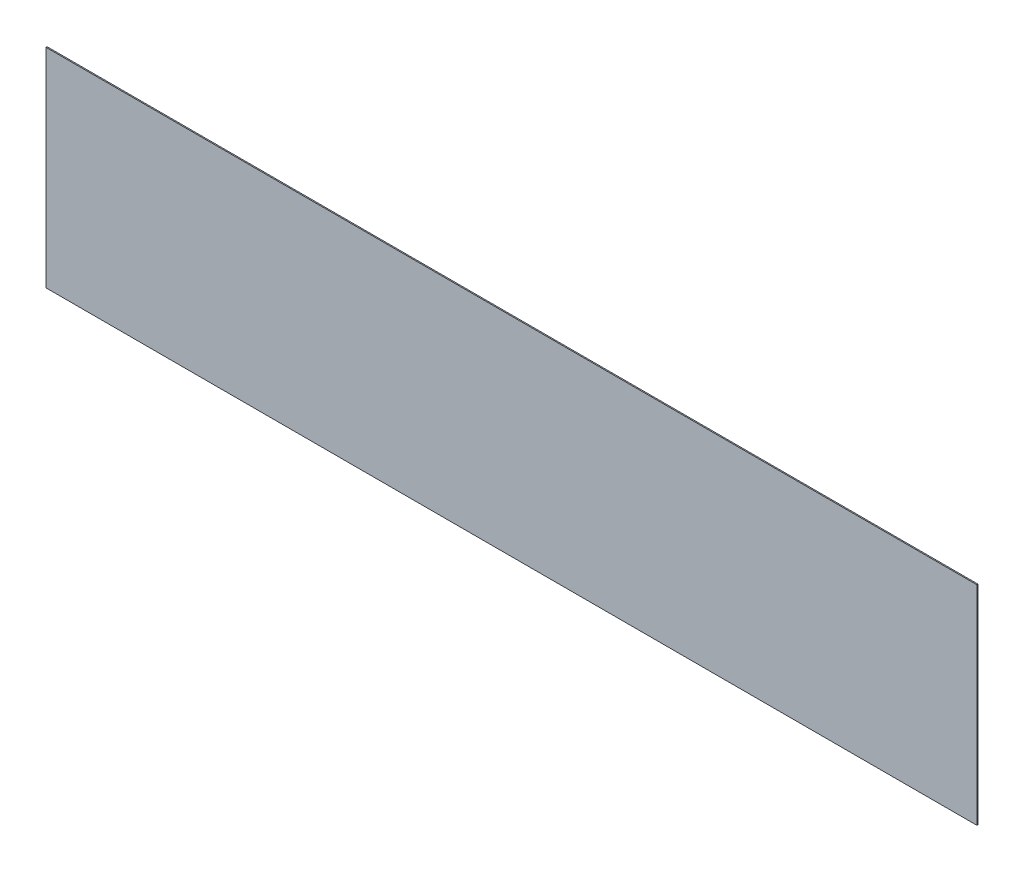
ISO-10303-21;
HEADER;
FILE_DESCRIPTION(('STEP AP214'),'2;1');
FILE_NAME('part.step','',(''),(''),'','','');
FILE_SCHEMA(('AUTOMOTIVE_DESIGN { 1 0 10303 214 1 1 1 1 }'));
ENDSEC;
DATA;
#1=APPLICATION_CONTEXT('core data for automotive mechanical design processes');
#2=APPLICATION_PROTOCOL_DEFINITION('international standard','automotive_design',2000,#1);
#3=PRODUCT_CONTEXT('',#1,'mechanical');
#4=PRODUCT('Part','Part','',(#3));
#5=PRODUCT_RELATED_PRODUCT_CATEGORY('part','',(#4));
#6=PRODUCT_DEFINITION_FORMATION('','',#4);
#7=PRODUCT_DEFINITION_CONTEXT('part definition',#1,'design');
#8=PRODUCT_DEFINITION('design','',#6,#7);
#9=PRODUCT_DEFINITION_SHAPE('','',#8);
#10=(LENGTH_UNIT() NAMED_UNIT(*) SI_UNIT(.MILLI.,.METRE.));
#11=(NAMED_UNIT(*) PLANE_ANGLE_UNIT() SI_UNIT($,.RADIAN.));
#12=(NAMED_UNIT(*) SI_UNIT($,.STERADIAN.) SOLID_ANGLE_UNIT());
#13=UNCERTAINTY_MEASURE_WITH_UNIT(LENGTH_MEASURE(1.E-05),#10,'distance_accuracy_value','');
#14=(GEOMETRIC_REPRESENTATION_CONTEXT(3) GLOBAL_UNCERTAINTY_ASSIGNED_CONTEXT((#13)) GLOBAL_UNIT_ASSIGNED_CONTEXT((#10,
#11,#12)) REPRESENTATION_CONTEXT('',''));
#15=CARTESIAN_POINT('',(0.,0.,0.));
#16=DIRECTION('',(0.,0.,1.));
#17=DIRECTION('',(1.,0.,0.));
#18=AXIS2_PLACEMENT_3D('',#15,#16,#17);
#19=CARTESIAN_POINT('',(-1333.5,298.45,3.175));
#20=DIRECTION('',(1.,0.,0.));
#21=DIRECTION('',(0.,1.,0.));
#22=AXIS2_PLACEMENT_3D('',#19,#20,#21);
#23=PLANE('',#22);
#24=DIRECTION('',(0.,-1.,0.));
#25=VECTOR('',#24,1.);
#26=CARTESIAN_POINT('',(-1333.5,298.45,0.));
#27=LINE('',#26,#25);
#28=CARTESIAN_POINT('',(-1333.5,298.45,0.));
#29=VERTEX_POINT('',#28);
#30=CARTESIAN_POINT('',(-1333.5,-298.45,0.));
#31=VERTEX_POINT('',#30);
#32=EDGE_CURVE('E96',#29,#31,#27,.T.);
#33=ORIENTED_EDGE('',*,*,#32,.T.);
#34=DIRECTION('',(0.,0.,-1.));
#35=VECTOR('',#34,1.);
#36=CARTESIAN_POINT('',(-1333.5,-298.45,3.175));
#37=LINE('',#36,#35);
#38=CARTESIAN_POINT('',(-1333.5,-298.45,3.175));
#39=VERTEX_POINT('',#38);
#40=EDGE_CURVE('E11',#39,#31,#37,.T.);
#41=ORIENTED_EDGE('',*,*,#40,.F.);
#42=DIRECTION('',(0.,-1.,0.));
#43=VECTOR('',#42,1.);
#44=CARTESIAN_POINT('',(-1333.5,298.45,3.175));
#45=LINE('',#44,#43);
#46=CARTESIAN_POINT('',(-1333.5,298.45,3.175));
#47=VERTEX_POINT('',#46);
#48=EDGE_CURVE('E84',#47,#39,#45,.T.);
#49=ORIENTED_EDGE('',*,*,#48,.F.);
#50=DIRECTION('',(0.,0.,-1.));
#51=VECTOR('',#50,1.);
#52=CARTESIAN_POINT('',(-1333.5,298.45,3.175));
#53=LINE('',#52,#51);
#54=EDGE_CURVE('E92',#47,#29,#53,.T.);
#55=ORIENTED_EDGE('',*,*,#54,.T.);
#56=EDGE_LOOP('',(#33,#41,#49,#55));
#57=FACE_BOUND('',#56,.T.);
#58=ADVANCED_FACE('F33',(#57),#23,.F.);
#59=CARTESIAN_POINT('',(1333.5,-298.45,3.175));
#60=DIRECTION('',(0.,1.,0.));
#61=DIRECTION('',(-1.,0.,0.));
#62=AXIS2_PLACEMENT_3D('',#59,#60,#61);
#63=PLANE('',#62);
#64=DIRECTION('',(1.,0.,0.));
#65=VECTOR('',#64,1.);
#66=CARTESIAN_POINT('',(1333.5,-298.45,0.));
#67=LINE('',#66,#65);
#68=CARTESIAN_POINT('',(1333.5,-298.45,0.));
#69=VERTEX_POINT('',#68);
#70=EDGE_CURVE('E88',#31,#69,#67,.T.);
#71=ORIENTED_EDGE('',*,*,#70,.T.);
#72=DIRECTION('',(0.,0.,-1.));
#73=VECTOR('',#72,1.);
#74=CARTESIAN_POINT('',(1333.5,-298.45,3.175));
#75=LINE('',#74,#73);
#76=CARTESIAN_POINT('',(1333.5,-298.45,3.175));
#77=VERTEX_POINT('',#76);
#78=EDGE_CURVE('E41',#77,#69,#75,.T.);
#79=ORIENTED_EDGE('',*,*,#78,.F.);
#80=DIRECTION('',(1.,0.,0.));
#81=VECTOR('',#80,1.);
#82=CARTESIAN_POINT('',(1333.5,-298.45,3.175));
#83=LINE('',#82,#81);
#84=EDGE_CURVE('E79',#39,#77,#83,.T.);
#85=ORIENTED_EDGE('',*,*,#84,.F.);
#86=ORIENTED_EDGE('',*,*,#40,.T.);
#87=EDGE_LOOP('',(#71,#79,#85,#86));
#88=FACE_BOUND('',#87,.T.);
#89=ADVANCED_FACE('F87',(#88),#63,.F.);
#90=CARTESIAN_POINT('',(1333.5,298.45,3.175));
#91=DIRECTION('',(-1.,0.,0.));
#92=DIRECTION('',(0.,0.,1.));
#93=AXIS2_PLACEMENT_3D('',#90,#91,#92);
#94=PLANE('',#93);
#95=DIRECTION('',(0.,1.,0.));
#96=VECTOR('',#95,1.);
#97=CARTESIAN_POINT('',(1333.5,298.45,0.));
#98=LINE('',#97,#96);
#99=CARTESIAN_POINT('',(1333.5,298.45,0.));
#100=VERTEX_POINT('',#99);
#101=EDGE_CURVE('E66',#69,#100,#98,.T.);
#102=ORIENTED_EDGE('',*,*,#101,.T.);
#103=DIRECTION('',(0.,0.,-1.));
#104=VECTOR('',#103,1.);
#105=CARTESIAN_POINT('',(1333.5,298.45,3.175));
#106=LINE('',#105,#104);
#107=CARTESIAN_POINT('',(1333.5,298.45,3.175));
#108=VERTEX_POINT('',#107);
#109=EDGE_CURVE('E89',#108,#100,#106,.T.);
#110=ORIENTED_EDGE('',*,*,#109,.F.);
#111=DIRECTION('',(0.,1.,0.));
#112=VECTOR('',#111,1.);
#113=CARTESIAN_POINT('',(1333.5,298.45,3.175));
#114=LINE('',#113,#112);
#115=EDGE_CURVE('E82',#77,#108,#114,.T.);
#116=ORIENTED_EDGE('',*,*,#115,.F.);
#117=ORIENTED_EDGE('',*,*,#78,.T.);
#118=EDGE_LOOP('',(#102,#110,#116,#117));
#119=FACE_BOUND('',#118,.T.);
#120=ADVANCED_FACE('F90',(#119),#94,.F.);
#121=CARTESIAN_POINT('',(1333.5,298.45,3.175));
#122=DIRECTION('',(0.,-1.,0.));
#123=DIRECTION('',(1.,0.,0.));
#124=AXIS2_PLACEMENT_3D('',#121,#122,#123);
#125=PLANE('',#124);
#126=DIRECTION('',(-1.,0.,0.));
#127=VECTOR('',#126,1.);
#128=CARTESIAN_POINT('',(1333.5,298.45,0.));
#129=LINE('',#128,#127);
#130=EDGE_CURVE('E72',#100,#29,#129,.T.);
#131=ORIENTED_EDGE('',*,*,#130,.T.);
#132=ORIENTED_EDGE('',*,*,#54,.F.);
#133=DIRECTION('',(-1.,0.,0.));
#134=VECTOR('',#133,1.);
#135=CARTESIAN_POINT('',(1333.5,298.45,3.175));
#136=LINE('',#135,#134);
#137=EDGE_CURVE('E49',#108,#47,#136,.T.);
#138=ORIENTED_EDGE('',*,*,#137,.F.);
#139=ORIENTED_EDGE('',*,*,#109,.T.);
#140=EDGE_LOOP('',(#131,#132,#138,#139));
#141=FACE_BOUND('',#140,.T.);
#142=ADVANCED_FACE('F103',(#141),#125,.F.);
#143=CARTESIAN_POINT('',(0.,0.,3.175));
#144=DIRECTION('',(0.,0.,-1.));
#145=DIRECTION('',(-1.,0.,0.));
#146=AXIS2_PLACEMENT_3D('',#143,#144,#145);
#147=PLANE('',#146);
#148=ORIENTED_EDGE('',*,*,#48,.T.);
#149=ORIENTED_EDGE('',*,*,#84,.T.);
#150=ORIENTED_EDGE('',*,*,#115,.T.);
#151=ORIENTED_EDGE('',*,*,#137,.T.);
#152=EDGE_LOOP('',(#148,#149,#150,#151));
#153=FACE_BOUND('',#152,.T.);
#154=ADVANCED_FACE('F80',(#153),#147,.F.);
#155=CARTESIAN_POINT('',(0.,0.,0.));
#156=DIRECTION('',(0.,0.,-1.));
#157=DIRECTION('',(-1.,0.,0.));
#158=AXIS2_PLACEMENT_3D('',#155,#156,#157);
#159=PLANE('',#158);
#160=ORIENTED_EDGE('',*,*,#32,.F.);
#161=ORIENTED_EDGE('',*,*,#130,.F.);
#162=ORIENTED_EDGE('',*,*,#101,.F.);
#163=ORIENTED_EDGE('',*,*,#70,.F.);
#164=EDGE_LOOP('',(#160,#161,#162,#163));
#165=FACE_BOUND('',#164,.T.);
#166=ADVANCED_FACE('F106',(#165),#159,.T.);
#167=CLOSED_SHELL('',(#58,#89,#120,#142,#154,#166));
#168=MANIFOLD_SOLID_BREP('B2',#167);
#169=ADVANCED_BREP_SHAPE_REPRESENTATION('',(#18,#168),#14);
#170=SHAPE_DEFINITION_REPRESENTATION(#9,#169);
ENDSEC;
END-ISO-10303-21;
